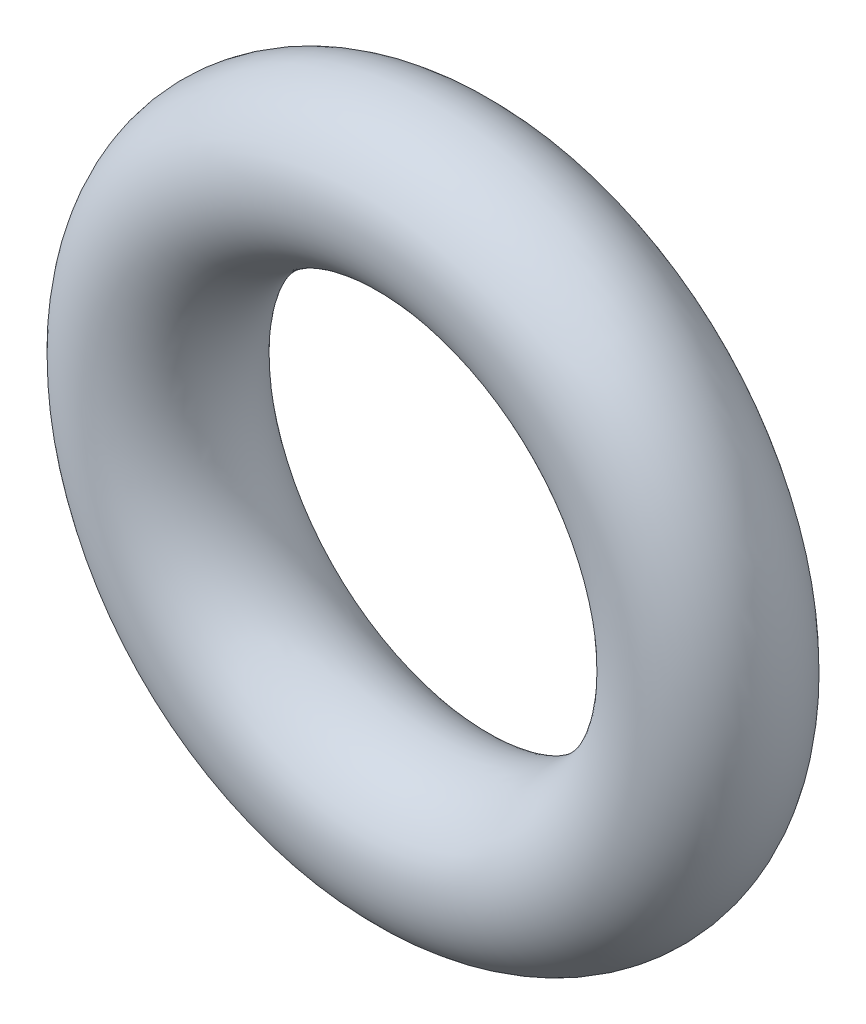
ISO-10303-21;
HEADER;
FILE_DESCRIPTION(('STEP AP214'),'2;1');
FILE_NAME('part.step','',(''),(''),'','','');
FILE_SCHEMA(('AUTOMOTIVE_DESIGN { 1 0 10303 214 1 1 1 1 }'));
ENDSEC;
DATA;
#1=APPLICATION_CONTEXT('core data for automotive mechanical design processes');
#2=APPLICATION_PROTOCOL_DEFINITION('international standard','automotive_design',2000,#1);
#3=PRODUCT_CONTEXT('',#1,'mechanical');
#4=PRODUCT('Part','Part','',(#3));
#5=PRODUCT_RELATED_PRODUCT_CATEGORY('part','',(#4));
#6=PRODUCT_DEFINITION_FORMATION('','',#4);
#7=PRODUCT_DEFINITION_CONTEXT('part definition',#1,'design');
#8=PRODUCT_DEFINITION('design','',#6,#7);
#9=PRODUCT_DEFINITION_SHAPE('','',#8);
#10=(LENGTH_UNIT() NAMED_UNIT(*) SI_UNIT(.MILLI.,.METRE.));
#11=(NAMED_UNIT(*) PLANE_ANGLE_UNIT() SI_UNIT($,.RADIAN.));
#12=(NAMED_UNIT(*) SI_UNIT($,.STERADIAN.) SOLID_ANGLE_UNIT());
#13=UNCERTAINTY_MEASURE_WITH_UNIT(LENGTH_MEASURE(1.E-05),#10,'distance_accuracy_value','');
#14=(GEOMETRIC_REPRESENTATION_CONTEXT(3) GLOBAL_UNCERTAINTY_ASSIGNED_CONTEXT((#13)) GLOBAL_UNIT_ASSIGNED_CONTEXT((#10,
#11,#12)) REPRESENTATION_CONTEXT('',''));
#15=CARTESIAN_POINT('',(0.,0.,0.));
#16=DIRECTION('',(0.,0.,1.));
#17=DIRECTION('',(1.,0.,0.));
#18=AXIS2_PLACEMENT_3D('',#15,#16,#17);
#19=CARTESIAN_POINT('',(0.,0.,0.));
#20=DIRECTION('',(0.,0.,1.));
#21=DIRECTION('',(1.,0.,0.));
#22=AXIS2_PLACEMENT_3D('',#19,#20,#21);
#23=TOROIDAL_SURFACE('',#22,35.,10.);
#24=CARTESIAN_POINT('',(45.,0.,0.));
#25=VERTEX_POINT('',#24);
#26=VERTEX_LOOP('',#25);
#27=FACE_BOUND('',#26,.T.);
#28=ADVANCED_FACE('F28',(#27),#23,.T.);
#29=CLOSED_SHELL('',(#28));
#30=MANIFOLD_SOLID_BREP('B2',#29);
#31=ADVANCED_BREP_SHAPE_REPRESENTATION('',(#18,#30),#14);
#32=SHAPE_DEFINITION_REPRESENTATION(#9,#31);
ENDSEC;
END-ISO-10303-21;
